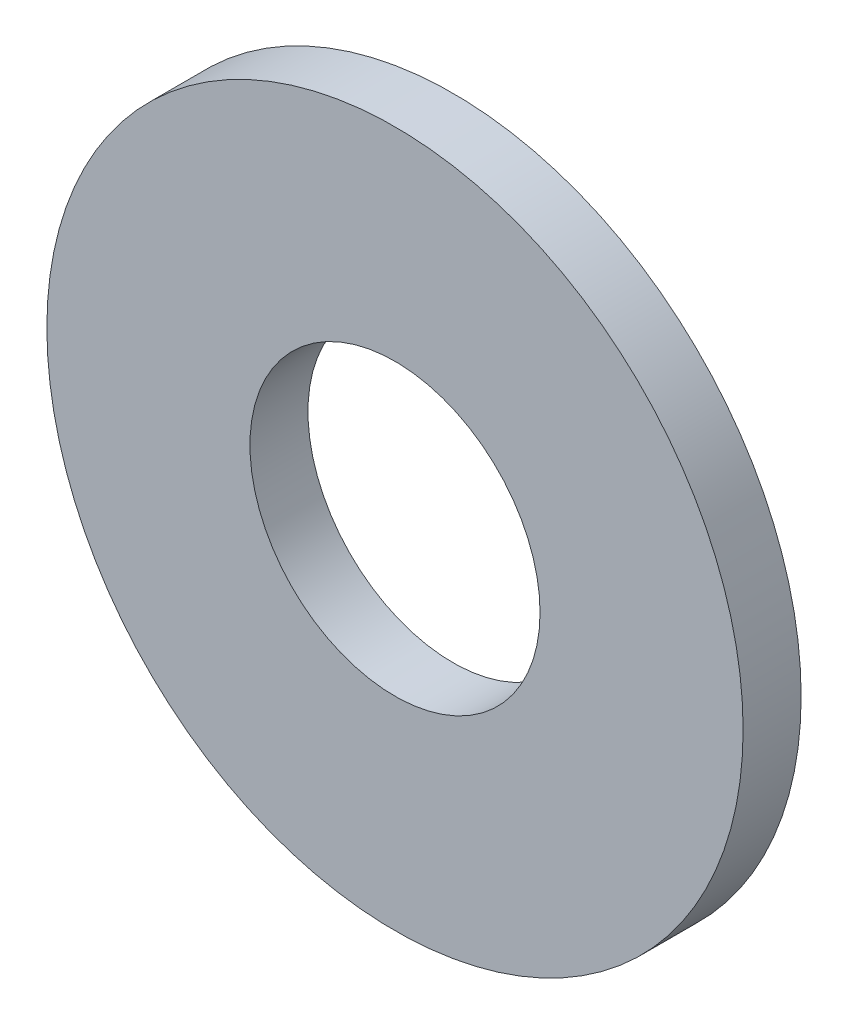
ISO-10303-21;
HEADER;
FILE_DESCRIPTION(('STEP AP214'),'2;1');
FILE_NAME('part.step','',(''),(''),'','','');
FILE_SCHEMA(('AUTOMOTIVE_DESIGN { 1 0 10303 214 1 1 1 1 }'));
ENDSEC;
DATA;
#1=APPLICATION_CONTEXT('core data for automotive mechanical design processes');
#2=APPLICATION_PROTOCOL_DEFINITION('international standard','automotive_design',2000,#1);
#3=PRODUCT_CONTEXT('',#1,'mechanical');
#4=PRODUCT('Part','Part','',(#3));
#5=PRODUCT_RELATED_PRODUCT_CATEGORY('part','',(#4));
#6=PRODUCT_DEFINITION_FORMATION('','',#4);
#7=PRODUCT_DEFINITION_CONTEXT('part definition',#1,'design');
#8=PRODUCT_DEFINITION('design','',#6,#7);
#9=PRODUCT_DEFINITION_SHAPE('','',#8);
#10=(LENGTH_UNIT() NAMED_UNIT(*) SI_UNIT(.MILLI.,.METRE.));
#11=(NAMED_UNIT(*) PLANE_ANGLE_UNIT() SI_UNIT($,.RADIAN.));
#12=(NAMED_UNIT(*) SI_UNIT($,.STERADIAN.) SOLID_ANGLE_UNIT());
#13=UNCERTAINTY_MEASURE_WITH_UNIT(LENGTH_MEASURE(1.E-05),#10,'distance_accuracy_value','');
#14=(GEOMETRIC_REPRESENTATION_CONTEXT(3) GLOBAL_UNCERTAINTY_ASSIGNED_CONTEXT((#13)) GLOBAL_UNIT_ASSIGNED_CONTEXT((#10,
#11,#12)) REPRESENTATION_CONTEXT('',''));
#15=CARTESIAN_POINT('',(0.,0.,0.));
#16=DIRECTION('',(0.,0.,1.));
#17=DIRECTION('',(1.,0.,0.));
#18=AXIS2_PLACEMENT_3D('',#15,#16,#17);
#19=CARTESIAN_POINT('',(-425.1,65.,58.));
#20=DIRECTION('',(0.,0.,1.));
#21=DIRECTION('',(1.,0.,0.));
#22=AXIS2_PLACEMENT_3D('',#19,#20,#21);
#23=PLANE('',#22);
#24=CARTESIAN_POINT('',(-425.1,65.,58.));
#25=DIRECTION('',(0.,0.,1.));
#26=DIRECTION('',(1.,0.,0.));
#27=AXIS2_PLACEMENT_3D('',#24,#25,#26);
#28=CIRCLE('',#27,5.);
#29=CARTESIAN_POINT('',(-420.1,65.,58.));
#30=VERTEX_POINT('',#29);
#31=EDGE_CURVE('E57',#30,#30,#28,.T.);
#32=ORIENTED_EDGE('',*,*,#31,.T.);
#33=EDGE_LOOP('',(#32));
#34=FACE_BOUND('',#33,.T.);
#35=CARTESIAN_POINT('',(-425.1,65.,58.));
#36=DIRECTION('',(0.,0.,1.));
#37=DIRECTION('',(1.,0.,0.));
#38=AXIS2_PLACEMENT_3D('',#35,#36,#37);
#39=CIRCLE('',#38,12.);
#40=CARTESIAN_POINT('',(-413.1,65.,58.));
#41=VERTEX_POINT('',#40);
#42=EDGE_CURVE('E49',#41,#41,#39,.T.);
#43=ORIENTED_EDGE('',*,*,#42,.F.);
#44=EDGE_LOOP('',(#43));
#45=FACE_BOUND('',#44,.T.);
#46=ADVANCED_FACE('F43',(#34,#45),#23,.F.);
#47=CARTESIAN_POINT('',(-425.1,65.,60.));
#48=DIRECTION('',(0.,0.,1.));
#49=DIRECTION('',(1.,0.,0.));
#50=AXIS2_PLACEMENT_3D('',#47,#48,#49);
#51=PLANE('',#50);
#52=CARTESIAN_POINT('',(-425.1,65.,60.));
#53=DIRECTION('',(0.,0.,1.));
#54=DIRECTION('',(1.,0.,0.));
#55=AXIS2_PLACEMENT_3D('',#52,#53,#54);
#56=CIRCLE('',#55,5.);
#57=CARTESIAN_POINT('',(-420.1,65.,60.));
#58=VERTEX_POINT('',#57);
#59=EDGE_CURVE('E53',#58,#58,#56,.T.);
#60=ORIENTED_EDGE('',*,*,#59,.F.);
#61=EDGE_LOOP('',(#60));
#62=FACE_BOUND('',#61,.T.);
#63=CARTESIAN_POINT('',(-425.1,65.,60.));
#64=DIRECTION('',(0.,0.,1.));
#65=DIRECTION('',(1.,0.,0.));
#66=AXIS2_PLACEMENT_3D('',#63,#64,#65);
#67=CIRCLE('',#66,12.);
#68=CARTESIAN_POINT('',(-413.1,65.,60.));
#69=VERTEX_POINT('',#68);
#70=EDGE_CURVE('E11',#69,#69,#67,.T.);
#71=ORIENTED_EDGE('',*,*,#70,.T.);
#72=EDGE_LOOP('',(#71));
#73=FACE_BOUND('',#72,.T.);
#74=ADVANCED_FACE('F73',(#62,#73),#51,.T.);
#75=CARTESIAN_POINT('',(-425.1,65.,58.));
#76=DIRECTION('',(0.,0.,1.));
#77=DIRECTION('',(1.,0.,0.));
#78=AXIS2_PLACEMENT_3D('',#75,#76,#77);
#79=CYLINDRICAL_SURFACE('',#78,12.);
#80=ORIENTED_EDGE('',*,*,#70,.F.);
#81=EDGE_LOOP('',(#80));
#82=FACE_BOUND('',#81,.T.);
#83=ORIENTED_EDGE('',*,*,#42,.T.);
#84=EDGE_LOOP('',(#83));
#85=FACE_BOUND('',#84,.T.);
#86=ADVANCED_FACE('F67',(#82,#85),#79,.T.);
#87=CARTESIAN_POINT('',(-425.1,65.,58.));
#88=DIRECTION('',(0.,0.,1.));
#89=DIRECTION('',(1.,0.,0.));
#90=AXIS2_PLACEMENT_3D('',#87,#88,#89);
#91=CYLINDRICAL_SURFACE('',#90,5.);
#92=ORIENTED_EDGE('',*,*,#59,.T.);
#93=EDGE_LOOP('',(#92));
#94=FACE_BOUND('',#93,.T.);
#95=ORIENTED_EDGE('',*,*,#31,.F.);
#96=EDGE_LOOP('',(#95));
#97=FACE_BOUND('',#96,.T.);
#98=ADVANCED_FACE('F65',(#94,#97),#91,.F.);
#99=CLOSED_SHELL('',(#46,#74,#86,#98));
#100=MANIFOLD_SOLID_BREP('B2',#99);
#101=ADVANCED_BREP_SHAPE_REPRESENTATION('',(#18,#100),#14);
#102=SHAPE_DEFINITION_REPRESENTATION(#9,#101);
ENDSEC;
END-ISO-10303-21;
